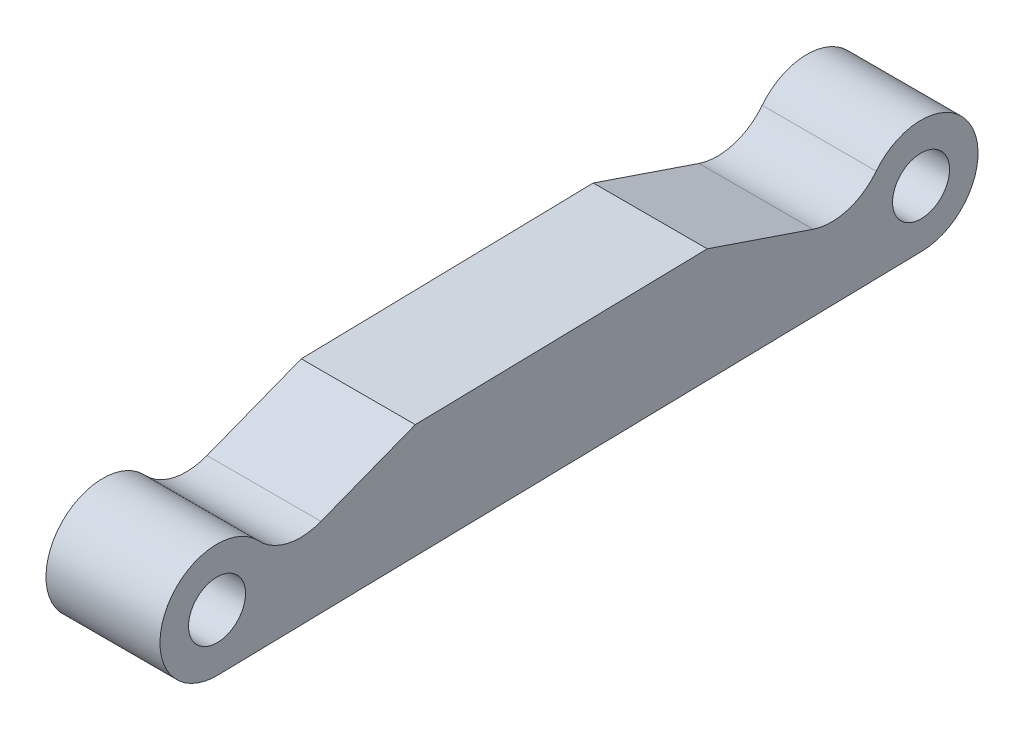
ISO-10303-21;
HEADER;
FILE_DESCRIPTION(('STEP AP214'),'2;1');
FILE_NAME('part.step','',(''),(''),'','','');
FILE_SCHEMA(('AUTOMOTIVE_DESIGN { 1 0 10303 214 1 1 1 1 }'));
ENDSEC;
DATA;
#1=APPLICATION_CONTEXT('core data for automotive mechanical design processes');
#2=APPLICATION_PROTOCOL_DEFINITION('international standard','automotive_design',2000,#1);
#3=PRODUCT_CONTEXT('',#1,'mechanical');
#4=PRODUCT('Part','Part','',(#3));
#5=PRODUCT_RELATED_PRODUCT_CATEGORY('part','',(#4));
#6=PRODUCT_DEFINITION_FORMATION('','',#4);
#7=PRODUCT_DEFINITION_CONTEXT('part definition',#1,'design');
#8=PRODUCT_DEFINITION('design','',#6,#7);
#9=PRODUCT_DEFINITION_SHAPE('','',#8);
#10=(LENGTH_UNIT() NAMED_UNIT(*) SI_UNIT(.MILLI.,.METRE.));
#11=(NAMED_UNIT(*) PLANE_ANGLE_UNIT() SI_UNIT($,.RADIAN.));
#12=(NAMED_UNIT(*) SI_UNIT($,.STERADIAN.) SOLID_ANGLE_UNIT());
#13=UNCERTAINTY_MEASURE_WITH_UNIT(LENGTH_MEASURE(1.E-05),#10,'distance_accuracy_value','');
#14=(GEOMETRIC_REPRESENTATION_CONTEXT(3) GLOBAL_UNCERTAINTY_ASSIGNED_CONTEXT((#13)) GLOBAL_UNIT_ASSIGNED_CONTEXT((#10,
#11,#12)) REPRESENTATION_CONTEXT('',''));
#15=CARTESIAN_POINT('',(0.,0.,0.));
#16=DIRECTION('',(0.,0.,1.));
#17=DIRECTION('',(1.,0.,0.));
#18=AXIS2_PLACEMENT_3D('',#15,#16,#17);
#19=CARTESIAN_POINT('',(-2.,-0.0995201185543006,-48.3115365364099));
#20=DIRECTION('',(1.,0.,0.));
#21=DIRECTION('',(0.,0.,-1.));
#22=AXIS2_PLACEMENT_3D('',#19,#20,#21);
#23=CYLINDRICAL_SURFACE('',#22,2.);
#24=DIRECTION('',(1.,0.,0.));
#25=VECTOR('',#24,1.);
#26=CARTESIAN_POINT('',(-2.,-1.46397362165025,-46.8492552235671));
#27=LINE('',#26,#25);
#28=CARTESIAN_POINT('',(-2.,-1.46397362165025,-46.8492552235671));
#29=VERTEX_POINT('',#28);
#30=CARTESIAN_POINT('',(2.,-1.46397362165025,-46.8492552235671));
#31=VERTEX_POINT('',#30);
#32=EDGE_CURVE('E41',#29,#31,#27,.T.);
#33=ORIENTED_EDGE('',*,*,#32,.T.);
#34=CARTESIAN_POINT('',(2.,-0.0995201185543006,-48.3115365364099));
#35=DIRECTION('',(1.,0.,0.));
#36=DIRECTION('',(0.,0.,-1.));
#37=AXIS2_PLACEMENT_3D('',#34,#35,#36);
#38=CIRCLE('',#37,2.);
#39=CARTESIAN_POINT('',(2.,-1.96378991615283,-49.0357589620237));
#40=VERTEX_POINT('',#39);
#41=EDGE_CURVE('E106',#31,#40,#38,.T.);
#42=ORIENTED_EDGE('',*,*,#41,.T.);
#43=DIRECTION('',(1.,0.,0.));
#44=VECTOR('',#43,1.);
#45=CARTESIAN_POINT('',(-2.,-1.96378991615283,-49.0357589620237));
#46=LINE('',#45,#44);
#47=CARTESIAN_POINT('',(-2.,-1.96378991615283,-49.0357589620237));
#48=VERTEX_POINT('',#47);
#49=EDGE_CURVE('E11',#48,#40,#46,.T.);
#50=ORIENTED_EDGE('',*,*,#49,.F.);
#51=CARTESIAN_POINT('',(-2.,-0.0995201185543006,-48.3115365364099));
#52=DIRECTION('',(1.,0.,0.));
#53=DIRECTION('',(0.,0.,-1.));
#54=AXIS2_PLACEMENT_3D('',#51,#52,#53);
#55=CIRCLE('',#54,2.);
#56=EDGE_CURVE('E54',#29,#48,#55,.T.);
#57=ORIENTED_EDGE('',*,*,#56,.F.);
#58=EDGE_LOOP('',(#33,#42,#50,#57));
#59=FACE_BOUND('',#58,.T.);
#60=ADVANCED_FACE('F38',(#59),#23,.F.);
#61=CARTESIAN_POINT('',(-2.,-18.2576472768404,-7.0926416411762));
#62=DIRECTION('',(0.,0.932134898799265,0.362111212806899));
#63=DIRECTION('',(0.,-0.362111212806899,0.932134898799265));
#64=AXIS2_PLACEMENT_3D('',#61,#62,#63);
#65=PLANE('',#64);
#66=ORIENTED_EDGE('',*,*,#49,.T.);
#67=DIRECTION('',(0.,-0.362111212806899,0.932134898799265));
#68=VECTOR('',#67,1.);
#69=CARTESIAN_POINT('',(2.,-18.2576472768404,-7.0926416411762));
#70=LINE('',#69,#68);
#71=CARTESIAN_POINT('',(2.,-0.678603011334067,-52.3440452649397));
#72=VERTEX_POINT('',#71);
#73=EDGE_CURVE('E123',#72,#40,#70,.T.);
#74=ORIENTED_EDGE('',*,*,#73,.F.);
#75=DIRECTION('',(1.,0.,0.));
#76=VECTOR('',#75,1.);
#77=CARTESIAN_POINT('',(-2.,-0.678603011334067,-52.3440452649397));
#78=LINE('',#77,#76);
#79=CARTESIAN_POINT('',(-2.,-0.678603011334067,-52.3440452649397));
#80=VERTEX_POINT('',#79);
#81=EDGE_CURVE('E46',#80,#72,#78,.T.);
#82=ORIENTED_EDGE('',*,*,#81,.F.);
#83=DIRECTION('',(0.,-0.362111212806899,0.932134898799265));
#84=VECTOR('',#83,1.);
#85=CARTESIAN_POINT('',(-2.,-18.2576472768404,-7.0926416411762));
#86=LINE('',#85,#84);
#87=EDGE_CURVE('E161',#80,#48,#86,.T.);
#88=ORIENTED_EDGE('',*,*,#87,.T.);
#89=EDGE_LOOP('',(#66,#74,#82,#88));
#90=FACE_BOUND('',#89,.T.);
#91=ADVANCED_FACE('F196',(#90),#65,.T.);
#92=CARTESIAN_POINT('',(-2.,-1.80156101186664,-0.0386781981501039));
#93=DIRECTION('',(0.,-0.999769614882737,-0.0214643228923018));
#94=DIRECTION('',(0.,0.0214643228923018,-0.999769614882737));
#95=AXIS2_PLACEMENT_3D('',#92,#93,#94);
#96=PLANE('',#95);
#97=ORIENTED_EDGE('',*,*,#81,.T.);
#98=DIRECTION('',(0.,0.0214643228923018,-0.999769614882737));
#99=VECTOR('',#98,1.);
#100=CARTESIAN_POINT('',(2.,-1.80156101186664,-0.0386781981501039));
#101=LINE('',#100,#99);
#102=CARTESIAN_POINT('',(2.,-0.458655680635526,-62.588796949412));
#103=VERTEX_POINT('',#102);
#104=EDGE_CURVE('E136',#72,#103,#101,.T.);
#105=ORIENTED_EDGE('',*,*,#104,.T.);
#106=DIRECTION('',(1.,0.,0.));
#107=VECTOR('',#106,1.);
#108=CARTESIAN_POINT('',(-2.,-0.458655680635526,-62.588796949412));
#109=LINE('',#108,#107);
#110=CARTESIAN_POINT('',(-2.,-0.458655680635526,-62.588796949412));
#111=VERTEX_POINT('',#110);
#112=EDGE_CURVE('E169',#111,#103,#109,.T.);
#113=ORIENTED_EDGE('',*,*,#112,.F.);
#114=DIRECTION('',(0.,0.0214643228923018,-0.999769614882737));
#115=VECTOR('',#114,1.);
#116=CARTESIAN_POINT('',(-2.,-1.80156101186664,-0.0386781981501039));
#117=LINE('',#116,#115);
#118=EDGE_CURVE('E159',#80,#111,#117,.T.);
#119=ORIENTED_EDGE('',*,*,#118,.F.);
#120=EDGE_LOOP('',(#97,#105,#113,#119));
#121=FACE_BOUND('',#120,.T.);
#122=ADVANCED_FACE('F195',(#121),#96,.F.);
#123=CARTESIAN_POINT('',(-2.,18.6570614009283,-6.34051563895938));
#124=DIRECTION('',(0.,-0.946817360383291,0.321771481142779));
#125=DIRECTION('',(0.,-0.321771481142779,-0.946817360383291));
#126=AXIS2_PLACEMENT_3D('',#123,#124,#125);
#127=PLANE('',#126);
#128=ORIENTED_EDGE('',*,*,#112,.T.);
#129=DIRECTION('',(0.,-0.321771481142779,-0.946817360383291));
#130=VECTOR('',#129,1.);
#131=CARTESIAN_POINT('',(2.,18.6570614009283,-6.34051563895938));
#132=LINE('',#131,#130);
#133=CARTESIAN_POINT('',(2.,-1.72000252756392,-66.3003287728511));
#134=VERTEX_POINT('',#133);
#135=EDGE_CURVE('E133',#103,#134,#132,.T.);
#136=ORIENTED_EDGE('',*,*,#135,.T.);
#137=DIRECTION('',(1.,0.,0.));
#138=VECTOR('',#137,1.);
#139=CARTESIAN_POINT('',(-2.,-1.72000252756392,-66.3003287728511));
#140=LINE('',#139,#138);
#141=CARTESIAN_POINT('',(-2.,-1.72000252756392,-66.3003287728511));
#142=VERTEX_POINT('',#141);
#143=EDGE_CURVE('E171',#142,#134,#140,.T.);
#144=ORIENTED_EDGE('',*,*,#143,.F.);
#145=DIRECTION('',(0.,-0.321771481142779,-0.946817360383291));
#146=VECTOR('',#145,1.);
#147=CARTESIAN_POINT('',(-2.,18.6570614009283,-6.34051563895938));
#148=LINE('',#147,#146);
#149=EDGE_CURVE('E157',#111,#142,#148,.T.);
#150=ORIENTED_EDGE('',*,*,#149,.F.);
#151=EDGE_LOOP('',(#128,#136,#144,#150));
#152=FACE_BOUND('',#151,.T.);
#153=ADVANCED_FACE('F191',(#152),#127,.F.);
#154=CARTESIAN_POINT('',(-2.,0.173632193202652,-66.9438717351366));
#155=DIRECTION('',(1.,0.,0.));
#156=DIRECTION('',(0.,0.,-1.));
#157=AXIS2_PLACEMENT_3D('',#154,#155,#156);
#158=CYLINDRICAL_SURFACE('',#157,2.);
#159=ORIENTED_EDGE('',*,*,#143,.T.);
#160=CARTESIAN_POINT('',(2.,0.173632193202652,-66.9438717351366));
#161=DIRECTION('',(1.,0.,0.));
#162=DIRECTION('',(0.,0.,-1.));
#163=AXIS2_PLACEMENT_3D('',#160,#161,#162);
#164=CIRCLE('',#163,2.);
#165=CARTESIAN_POINT('',(2.,-1.06223242282681,-68.5163343422743));
#166=VERTEX_POINT('',#165);
#167=EDGE_CURVE('E130',#134,#166,#164,.T.);
#168=ORIENTED_EDGE('',*,*,#167,.T.);
#169=DIRECTION('',(1.,0.,0.));
#170=VECTOR('',#169,1.);
#171=CARTESIAN_POINT('',(-2.,-1.06223242282681,-68.5163343422743));
#172=LINE('',#171,#170);
#173=CARTESIAN_POINT('',(-2.,-1.06223242282681,-68.5163343422743));
#174=VERTEX_POINT('',#173);
#175=EDGE_CURVE('E173',#174,#166,#172,.T.);
#176=ORIENTED_EDGE('',*,*,#175,.F.);
#177=CARTESIAN_POINT('',(-2.,0.173632193202652,-66.9438717351366));
#178=DIRECTION('',(1.,0.,0.));
#179=DIRECTION('',(0.,0.,-1.));
#180=AXIS2_PLACEMENT_3D('',#177,#178,#179);
#181=CIRCLE('',#180,2.);
#182=EDGE_CURVE('E155',#142,#174,#181,.T.);
#183=ORIENTED_EDGE('',*,*,#182,.F.);
#184=EDGE_LOOP('',(#159,#168,#176,#183));
#185=FACE_BOUND('',#184,.T.);
#186=ADVANCED_FACE('F187',(#185),#158,.F.);
#187=CARTESIAN_POINT('',(-2.,-2.29809703885627,-70.0887969494121));
#188=DIRECTION('',(1.,0.,0.));
#189=DIRECTION('',(0.,0.,-1.));
#190=AXIS2_PLACEMENT_3D('',#187,#188,#189);
#191=CYLINDRICAL_SURFACE('',#190,2.);
#192=ORIENTED_EDGE('',*,*,#175,.T.);
#193=CARTESIAN_POINT('',(2.,-2.29809703885627,-70.0887969494121));
#194=DIRECTION('',(1.,0.,0.));
#195=DIRECTION('',(0.,0.,-1.));
#196=AXIS2_PLACEMENT_3D('',#193,#194,#195);
#197=CIRCLE('',#196,2.);
#198=CARTESIAN_POINT('',(2.,-4.29763626862174,-70.1317255951967));
#199=VERTEX_POINT('',#198);
#200=EDGE_CURVE('E127',#199,#166,#197,.T.);
#201=ORIENTED_EDGE('',*,*,#200,.F.);
#202=DIRECTION('',(1.,0.,0.));
#203=VECTOR('',#202,1.);
#204=CARTESIAN_POINT('',(-2.,-4.29763626862174,-70.1317255951967));
#205=LINE('',#204,#203);
#206=CARTESIAN_POINT('',(-2.,-4.29763626862174,-70.1317255951967));
#207=VERTEX_POINT('',#206);
#208=EDGE_CURVE('E175',#207,#199,#205,.T.);
#209=ORIENTED_EDGE('',*,*,#208,.F.);
#210=CARTESIAN_POINT('',(-2.,-2.29809703885627,-70.0887969494121));
#211=DIRECTION('',(1.,0.,0.));
#212=DIRECTION('',(0.,0.,-1.));
#213=AXIS2_PLACEMENT_3D('',#210,#211,#212);
#214=CIRCLE('',#213,2.);
#215=EDGE_CURVE('E152',#207,#174,#214,.T.);
#216=ORIENTED_EDGE('',*,*,#215,.T.);
#217=EDGE_LOOP('',(#192,#201,#209,#216));
#218=FACE_BOUND('',#217,.T.);
#219=ADVANCED_FACE('F183',(#218),#191,.T.);
#220=CARTESIAN_POINT('',(-2.,-5.80063947139761,-0.124535489719314));
#221=DIRECTION('',(0.,-0.999769614882737,-0.0214643228923022));
#222=DIRECTION('',(0.,0.0214643228923022,-0.999769614882737));
#223=AXIS2_PLACEMENT_3D('',#220,#221,#222);
#224=PLANE('',#223);
#225=ORIENTED_EDGE('',*,*,#208,.T.);
#226=DIRECTION('',(0.,0.0214643228923022,-0.999769614882737));
#227=VECTOR('',#226,1.);
#228=CARTESIAN_POINT('',(2.,-5.80063947139761,-0.124535489719314));
#229=LINE('',#228,#227);
#230=CARTESIAN_POINT('',(2.,-4.82796635451167,-45.4299025565089));
#231=VERTEX_POINT('',#230);
#232=EDGE_CURVE('E117',#231,#199,#229,.T.);
#233=ORIENTED_EDGE('',*,*,#232,.F.);
#234=DIRECTION('',(1.,0.,0.));
#235=VECTOR('',#234,1.);
#236=CARTESIAN_POINT('',(-2.,-4.82796635451167,-45.4299025565089));
#237=LINE('',#236,#235);
#238=CARTESIAN_POINT('',(-2.,-4.82796635451167,-45.4299025565089));
#239=VERTEX_POINT('',#238);
#240=EDGE_CURVE('E109',#239,#231,#237,.T.);
#241=ORIENTED_EDGE('',*,*,#240,.F.);
#242=DIRECTION('',(0.,0.0214643228923022,-0.999769614882737));
#243=VECTOR('',#242,1.);
#244=CARTESIAN_POINT('',(-2.,-5.80063947139761,-0.124535489719314));
#245=LINE('',#244,#243);
#246=EDGE_CURVE('E149',#239,#207,#245,.T.);
#247=ORIENTED_EDGE('',*,*,#246,.T.);
#248=EDGE_LOOP('',(#225,#233,#241,#247));
#249=FACE_BOUND('',#248,.T.);
#250=ADVANCED_FACE('F177',(#249),#224,.T.);
#251=CARTESIAN_POINT('',(-2.,-2.29809703885627,-70.0887969494121));
#252=DIRECTION('',(1.,0.,0.));
#253=DIRECTION('',(0.,0.,-1.));
#254=AXIS2_PLACEMENT_3D('',#251,#252,#253);
#255=CYLINDRICAL_SURFACE('',#254,0.999999999999998);
#256=CARTESIAN_POINT('',(-2.,-2.29809703885627,-70.0887969494121));
#257=DIRECTION('',(1.,0.,0.));
#258=DIRECTION('',(0.,0.,-1.));
#259=AXIS2_PLACEMENT_3D('',#256,#257,#258);
#260=CIRCLE('',#259,0.999999999999998);
#261=CARTESIAN_POINT('',(-2.,-2.29809703885627,-71.0887969494121));
#262=VERTEX_POINT('',#261);
#263=EDGE_CURVE('E163',#262,#262,#260,.T.);
#264=ORIENTED_EDGE('',*,*,#263,.F.);
#265=EDGE_LOOP('',(#264));
#266=FACE_BOUND('',#265,.T.);
#267=CARTESIAN_POINT('',(2.,-2.29809703885627,-70.0887969494121));
#268=DIRECTION('',(1.,0.,0.));
#269=DIRECTION('',(0.,0.,-1.));
#270=AXIS2_PLACEMENT_3D('',#267,#268,#269);
#271=CIRCLE('',#270,0.999999999999998);
#272=CARTESIAN_POINT('',(2.,-2.29809703885627,-71.0887969494121));
#273=VERTEX_POINT('',#272);
#274=EDGE_CURVE('E140',#273,#273,#271,.T.);
#275=ORIENTED_EDGE('',*,*,#274,.T.);
#276=EDGE_LOOP('',(#275));
#277=FACE_BOUND('',#276,.T.);
#278=ADVANCED_FACE('F225',(#266,#277),#255,.F.);
#279=CARTESIAN_POINT('',(-2.,-2.8284271247462,-45.3869739107243));
#280=DIRECTION('',(1.,0.,0.));
#281=DIRECTION('',(0.,0.,-1.));
#282=AXIS2_PLACEMENT_3D('',#279,#280,#281);
#283=CYLINDRICAL_SURFACE('',#282,2.);
#284=ORIENTED_EDGE('',*,*,#240,.T.);
#285=CARTESIAN_POINT('',(2.,-2.8284271247462,-45.3869739107243));
#286=DIRECTION('',(1.,0.,0.));
#287=DIRECTION('',(0.,0.,-1.));
#288=AXIS2_PLACEMENT_3D('',#285,#286,#287);
#289=CIRCLE('',#288,2.);
#290=EDGE_CURVE('E112',#31,#231,#289,.T.);
#291=ORIENTED_EDGE('',*,*,#290,.F.);
#292=ORIENTED_EDGE('',*,*,#32,.F.);
#293=CARTESIAN_POINT('',(-2.,-2.8284271247462,-45.3869739107243));
#294=DIRECTION('',(1.,0.,0.));
#295=DIRECTION('',(0.,0.,-1.));
#296=AXIS2_PLACEMENT_3D('',#293,#294,#295);
#297=CIRCLE('',#296,2.);
#298=EDGE_CURVE('E147',#29,#239,#297,.T.);
#299=ORIENTED_EDGE('',*,*,#298,.T.);
#300=EDGE_LOOP('',(#284,#291,#292,#299));
#301=FACE_BOUND('',#300,.T.);
#302=ADVANCED_FACE('F113',(#301),#283,.T.);
#303=CARTESIAN_POINT('',(-2.,-2.8284271247462,-45.3869739107243));
#304=DIRECTION('',(1.,0.,0.));
#305=DIRECTION('',(0.,0.,-1.));
#306=AXIS2_PLACEMENT_3D('',#303,#304,#305);
#307=CYLINDRICAL_SURFACE('',#306,0.999999999999998);
#308=CARTESIAN_POINT('',(-2.,-2.8284271247462,-45.3869739107243));
#309=DIRECTION('',(1.,0.,0.));
#310=DIRECTION('',(0.,0.,-1.));
#311=AXIS2_PLACEMENT_3D('',#308,#309,#310);
#312=CIRCLE('',#311,0.999999999999998);
#313=CARTESIAN_POINT('',(-2.,-2.8284271247462,-46.3869739107243));
#314=VERTEX_POINT('',#313);
#315=EDGE_CURVE('E110',#314,#314,#312,.T.);
#316=ORIENTED_EDGE('',*,*,#315,.F.);
#317=EDGE_LOOP('',(#316));
#318=FACE_BOUND('',#317,.T.);
#319=CARTESIAN_POINT('',(2.,-2.8284271247462,-45.3869739107243));
#320=DIRECTION('',(1.,0.,0.));
#321=DIRECTION('',(0.,0.,-1.));
#322=AXIS2_PLACEMENT_3D('',#319,#320,#321);
#323=CIRCLE('',#322,0.999999999999998);
#324=CARTESIAN_POINT('',(2.,-2.8284271247462,-46.3869739107243));
#325=VERTEX_POINT('',#324);
#326=EDGE_CURVE('E143',#325,#325,#323,.T.);
#327=ORIENTED_EDGE('',*,*,#326,.T.);
#328=EDGE_LOOP('',(#327));
#329=FACE_BOUND('',#328,.T.);
#330=ADVANCED_FACE('F200',(#318,#329),#307,.F.);
#331=CARTESIAN_POINT('',(-2.,0.,0.));
#332=DIRECTION('',(1.,0.,0.));
#333=DIRECTION('',(0.,0.,-1.));
#334=AXIS2_PLACEMENT_3D('',#331,#332,#333);
#335=PLANE('',#334);
#336=ORIENTED_EDGE('',*,*,#56,.T.);
#337=ORIENTED_EDGE('',*,*,#87,.F.);
#338=ORIENTED_EDGE('',*,*,#118,.T.);
#339=ORIENTED_EDGE('',*,*,#149,.T.);
#340=ORIENTED_EDGE('',*,*,#182,.T.);
#341=ORIENTED_EDGE('',*,*,#215,.F.);
#342=ORIENTED_EDGE('',*,*,#246,.F.);
#343=ORIENTED_EDGE('',*,*,#298,.F.);
#344=EDGE_LOOP('',(#336,#337,#338,#339,#340,#341,#342,#343));
#345=FACE_BOUND('',#344,.T.);
#346=ORIENTED_EDGE('',*,*,#263,.T.);
#347=EDGE_LOOP('',(#346));
#348=FACE_BOUND('',#347,.T.);
#349=ORIENTED_EDGE('',*,*,#315,.T.);
#350=EDGE_LOOP('',(#349));
#351=FACE_BOUND('',#350,.T.);
#352=ADVANCED_FACE('F197',(#345,#348,#351),#335,.F.);
#353=CARTESIAN_POINT('',(2.,0.,0.));
#354=DIRECTION('',(1.,0.,0.));
#355=DIRECTION('',(0.,0.,-1.));
#356=AXIS2_PLACEMENT_3D('',#353,#354,#355);
#357=PLANE('',#356);
#358=ORIENTED_EDGE('',*,*,#41,.F.);
#359=ORIENTED_EDGE('',*,*,#290,.T.);
#360=ORIENTED_EDGE('',*,*,#232,.T.);
#361=ORIENTED_EDGE('',*,*,#200,.T.);
#362=ORIENTED_EDGE('',*,*,#167,.F.);
#363=ORIENTED_EDGE('',*,*,#135,.F.);
#364=ORIENTED_EDGE('',*,*,#104,.F.);
#365=ORIENTED_EDGE('',*,*,#73,.T.);
#366=EDGE_LOOP('',(#358,#359,#360,#361,#362,#363,#364,#365));
#367=FACE_BOUND('',#366,.T.);
#368=ORIENTED_EDGE('',*,*,#274,.F.);
#369=EDGE_LOOP('',(#368));
#370=FACE_BOUND('',#369,.T.);
#371=ORIENTED_EDGE('',*,*,#326,.F.);
#372=EDGE_LOOP('',(#371));
#373=FACE_BOUND('',#372,.T.);
#374=ADVANCED_FACE('F120',(#367,#370,#373),#357,.T.);
#375=CLOSED_SHELL('',(#60,#91,#122,#153,#186,#219,#250,#278,#302,#330,#352,#374));
#376=MANIFOLD_SOLID_BREP('B2',#375);
#377=ADVANCED_BREP_SHAPE_REPRESENTATION('',(#18,#376),#14);
#378=SHAPE_DEFINITION_REPRESENTATION(#9,#377);
ENDSEC;
END-ISO-10303-21;
